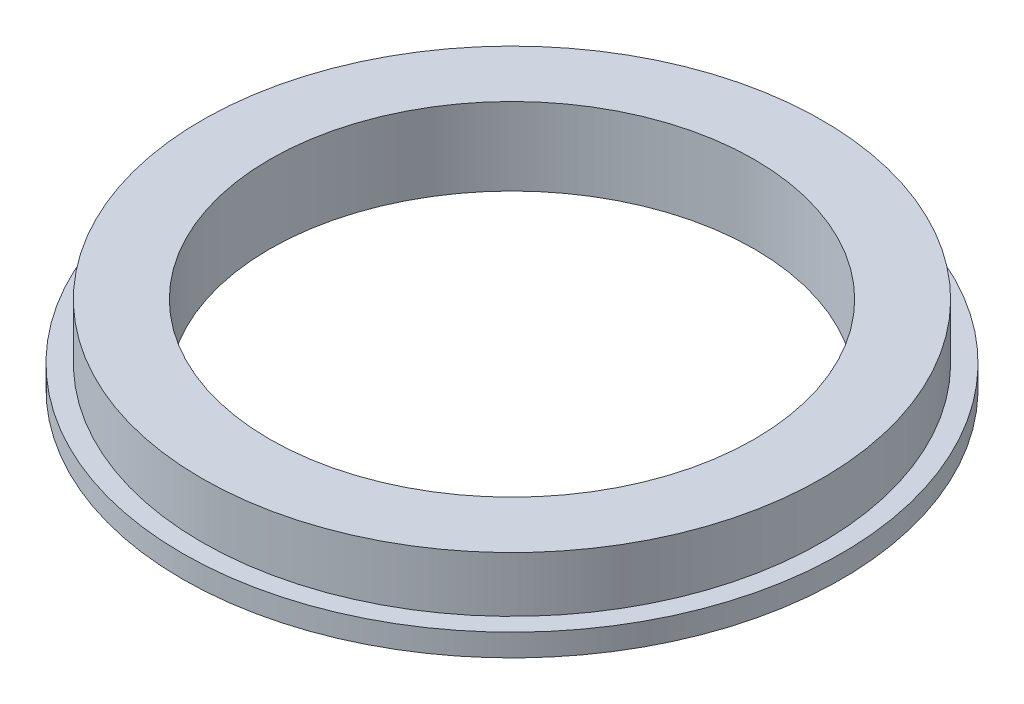
ISO-10303-21;
HEADER;
FILE_DESCRIPTION(('STEP AP214'),'2;1');
FILE_NAME('part.step','',(''),(''),'','','');
FILE_SCHEMA(('AUTOMOTIVE_DESIGN { 1 0 10303 214 1 1 1 1 }'));
ENDSEC;
DATA;
#1=APPLICATION_CONTEXT('core data for automotive mechanical design processes');
#2=APPLICATION_PROTOCOL_DEFINITION('international standard','automotive_design',2000,#1);
#3=PRODUCT_CONTEXT('',#1,'mechanical');
#4=PRODUCT('Part','Part','',(#3));
#5=PRODUCT_RELATED_PRODUCT_CATEGORY('part','',(#4));
#6=PRODUCT_DEFINITION_FORMATION('','',#4);
#7=PRODUCT_DEFINITION_CONTEXT('part definition',#1,'design');
#8=PRODUCT_DEFINITION('design','',#6,#7);
#9=PRODUCT_DEFINITION_SHAPE('','',#8);
#10=(LENGTH_UNIT() NAMED_UNIT(*) SI_UNIT(.MILLI.,.METRE.));
#11=(NAMED_UNIT(*) PLANE_ANGLE_UNIT() SI_UNIT($,.RADIAN.));
#12=(NAMED_UNIT(*) SI_UNIT($,.STERADIAN.) SOLID_ANGLE_UNIT());
#13=UNCERTAINTY_MEASURE_WITH_UNIT(LENGTH_MEASURE(1.E-05),#10,'distance_accuracy_value','');
#14=(GEOMETRIC_REPRESENTATION_CONTEXT(3) GLOBAL_UNCERTAINTY_ASSIGNED_CONTEXT((#13)) GLOBAL_UNIT_ASSIGNED_CONTEXT((#10,
#11,#12)) REPRESENTATION_CONTEXT('',''));
#15=CARTESIAN_POINT('',(0.,0.,0.));
#16=DIRECTION('',(0.,0.,1.));
#17=DIRECTION('',(1.,0.,0.));
#18=AXIS2_PLACEMENT_3D('',#15,#16,#17);
#19=CARTESIAN_POINT('',(0.,2.85,0.));
#20=DIRECTION('',(0.,1.,0.));
#21=DIRECTION('',(0.,0.,1.));
#22=AXIS2_PLACEMENT_3D('',#19,#20,#21);
#23=PLANE('',#22);
#24=CARTESIAN_POINT('',(0.,2.85,0.));
#25=DIRECTION('',(0.,1.,0.));
#26=DIRECTION('',(0.,0.,1.));
#27=AXIS2_PLACEMENT_3D('',#24,#25,#26);
#28=CIRCLE('',#27,16.);
#29=CARTESIAN_POINT('',(0.,2.85,16.));
#30=VERTEX_POINT('',#29);
#31=EDGE_CURVE('E10',#30,#30,#28,.T.);
#32=ORIENTED_EDGE('',*,*,#31,.T.);
#33=EDGE_LOOP('',(#32));
#34=FACE_BOUND('',#33,.T.);
#35=CARTESIAN_POINT('',(0.,2.85,0.));
#36=DIRECTION('',(0.,1.,0.));
#37=DIRECTION('',(0.,0.,1.));
#38=AXIS2_PLACEMENT_3D('',#35,#36,#37);
#39=CIRCLE('',#38,12.5);
#40=CARTESIAN_POINT('',(0.,2.85,12.5));
#41=VERTEX_POINT('',#40);
#42=EDGE_CURVE('E46',#41,#41,#39,.T.);
#43=ORIENTED_EDGE('',*,*,#42,.F.);
#44=EDGE_LOOP('',(#43));
#45=FACE_BOUND('',#44,.T.);
#46=ADVANCED_FACE('F37',(#34,#45),#23,.T.);
#47=CARTESIAN_POINT('',(0.,2.85,0.));
#48=DIRECTION('',(0.,-1.,0.));
#49=DIRECTION('',(0.,0.,-1.));
#50=AXIS2_PLACEMENT_3D('',#47,#48,#49);
#51=CYLINDRICAL_SURFACE('',#50,16.);
#52=ORIENTED_EDGE('',*,*,#31,.F.);
#53=EDGE_LOOP('',(#52));
#54=FACE_BOUND('',#53,.T.);
#55=CARTESIAN_POINT('',(0.,0.,0.));
#56=DIRECTION('',(0.,1.,0.));
#57=DIRECTION('',(0.,0.,1.));
#58=AXIS2_PLACEMENT_3D('',#55,#56,#57);
#59=CIRCLE('',#58,16.);
#60=CARTESIAN_POINT('',(0.,0.,16.));
#61=VERTEX_POINT('',#60);
#62=EDGE_CURVE('E41',#61,#61,#59,.T.);
#63=ORIENTED_EDGE('',*,*,#62,.T.);
#64=EDGE_LOOP('',(#63));
#65=FACE_BOUND('',#64,.T.);
#66=ADVANCED_FACE('F39',(#54,#65),#51,.T.);
#67=CARTESIAN_POINT('',(0.,2.85,0.));
#68=DIRECTION('',(0.,-1.,0.));
#69=DIRECTION('',(0.,0.,-1.));
#70=AXIS2_PLACEMENT_3D('',#67,#68,#69);
#71=CYLINDRICAL_SURFACE('',#70,12.5);
#72=ORIENTED_EDGE('',*,*,#42,.T.);
#73=EDGE_LOOP('',(#72));
#74=FACE_BOUND('',#73,.T.);
#75=CARTESIAN_POINT('',(0.,-1.15,0.));
#76=DIRECTION('',(0.,-1.,0.));
#77=DIRECTION('',(0.,0.,-1.));
#78=AXIS2_PLACEMENT_3D('',#75,#76,#77);
#79=CIRCLE('',#78,12.5);
#80=CARTESIAN_POINT('',(0.,-1.15,-12.5));
#81=VERTEX_POINT('',#80);
#82=EDGE_CURVE('E58',#81,#81,#79,.T.);
#83=ORIENTED_EDGE('',*,*,#82,.T.);
#84=EDGE_LOOP('',(#83));
#85=FACE_BOUND('',#84,.T.);
#86=ADVANCED_FACE('F66',(#74,#85),#71,.F.);
#87=CARTESIAN_POINT('',(0.,-1.15,0.));
#88=DIRECTION('',(0.,-1.,0.));
#89=DIRECTION('',(0.,0.,-1.));
#90=AXIS2_PLACEMENT_3D('',#87,#88,#89);
#91=PLANE('',#90);
#92=CARTESIAN_POINT('',(0.,-1.15,0.));
#93=DIRECTION('',(0.,-1.,0.));
#94=DIRECTION('',(0.,0.,-1.));
#95=AXIS2_PLACEMENT_3D('',#92,#93,#94);
#96=CIRCLE('',#95,17.);
#97=CARTESIAN_POINT('',(0.,-1.15,-17.));
#98=VERTEX_POINT('',#97);
#99=EDGE_CURVE('E57',#98,#98,#96,.T.);
#100=ORIENTED_EDGE('',*,*,#99,.T.);
#101=EDGE_LOOP('',(#100));
#102=FACE_BOUND('',#101,.T.);
#103=ORIENTED_EDGE('',*,*,#82,.F.);
#104=EDGE_LOOP('',(#103));
#105=FACE_BOUND('',#104,.T.);
#106=ADVANCED_FACE('F68',(#102,#105),#91,.T.);
#107=CARTESIAN_POINT('',(0.,0.,0.));
#108=DIRECTION('',(0.,-1.,0.));
#109=DIRECTION('',(0.,0.,-1.));
#110=AXIS2_PLACEMENT_3D('',#107,#108,#109);
#111=PLANE('',#110);
#112=ORIENTED_EDGE('',*,*,#62,.F.);
#113=EDGE_LOOP('',(#112));
#114=FACE_BOUND('',#113,.T.);
#115=CARTESIAN_POINT('',(0.,0.,0.));
#116=DIRECTION('',(0.,-1.,0.));
#117=DIRECTION('',(0.,0.,-1.));
#118=AXIS2_PLACEMENT_3D('',#115,#116,#117);
#119=CIRCLE('',#118,17.);
#120=CARTESIAN_POINT('',(0.,0.,-17.));
#121=VERTEX_POINT('',#120);
#122=EDGE_CURVE('E53',#121,#121,#119,.T.);
#123=ORIENTED_EDGE('',*,*,#122,.F.);
#124=EDGE_LOOP('',(#123));
#125=FACE_BOUND('',#124,.T.);
#126=ADVANCED_FACE('F70',(#114,#125),#111,.F.);
#127=CARTESIAN_POINT('',(0.,-1.15,0.));
#128=DIRECTION('',(0.,1.,0.));
#129=DIRECTION('',(0.,0.,1.));
#130=AXIS2_PLACEMENT_3D('',#127,#128,#129);
#131=CYLINDRICAL_SURFACE('',#130,17.);
#132=ORIENTED_EDGE('',*,*,#99,.F.);
#133=EDGE_LOOP('',(#132));
#134=FACE_BOUND('',#133,.T.);
#135=ORIENTED_EDGE('',*,*,#122,.T.);
#136=EDGE_LOOP('',(#135));
#137=FACE_BOUND('',#136,.T.);
#138=ADVANCED_FACE('F77',(#134,#137),#131,.T.);
#139=CLOSED_SHELL('',(#46,#66,#86,#106,#126,#138));
#140=MANIFOLD_SOLID_BREP('B2',#139);
#141=ADVANCED_BREP_SHAPE_REPRESENTATION('',(#18,#140),#14);
#142=SHAPE_DEFINITION_REPRESENTATION(#9,#141);
ENDSEC;
END-ISO-10303-21;
